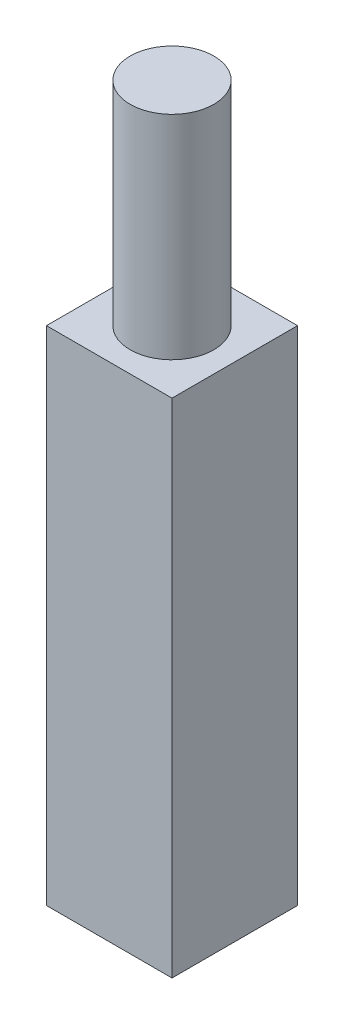
ISO-10303-21;
HEADER;
FILE_DESCRIPTION(('STEP AP214'),'2;1');
FILE_NAME('part.step','',(''),(''),'','','');
FILE_SCHEMA(('AUTOMOTIVE_DESIGN { 1 0 10303 214 1 1 1 1 }'));
ENDSEC;
DATA;
#1=APPLICATION_CONTEXT('core data for automotive mechanical design processes');
#2=APPLICATION_PROTOCOL_DEFINITION('international standard','automotive_design',2000,#1);
#3=PRODUCT_CONTEXT('',#1,'mechanical');
#4=PRODUCT('Part','Part','',(#3));
#5=PRODUCT_RELATED_PRODUCT_CATEGORY('part','',(#4));
#6=PRODUCT_DEFINITION_FORMATION('','',#4);
#7=PRODUCT_DEFINITION_CONTEXT('part definition',#1,'design');
#8=PRODUCT_DEFINITION('design','',#6,#7);
#9=PRODUCT_DEFINITION_SHAPE('','',#8);
#10=(LENGTH_UNIT() NAMED_UNIT(*) SI_UNIT(.MILLI.,.METRE.));
#11=(NAMED_UNIT(*) PLANE_ANGLE_UNIT() SI_UNIT($,.RADIAN.));
#12=(NAMED_UNIT(*) SI_UNIT($,.STERADIAN.) SOLID_ANGLE_UNIT());
#13=UNCERTAINTY_MEASURE_WITH_UNIT(LENGTH_MEASURE(1.E-05),#10,'distance_accuracy_value','');
#14=(GEOMETRIC_REPRESENTATION_CONTEXT(3) GLOBAL_UNCERTAINTY_ASSIGNED_CONTEXT((#13)) GLOBAL_UNIT_ASSIGNED_CONTEXT((#10,
#11,#12)) REPRESENTATION_CONTEXT('',''));
#15=CARTESIAN_POINT('',(0.,0.,0.));
#16=DIRECTION('',(0.,0.,1.));
#17=DIRECTION('',(1.,0.,0.));
#18=AXIS2_PLACEMENT_3D('',#15,#16,#17);
#19=CARTESIAN_POINT('',(7.49999999999998,60.,-7.50000000000009));
#20=DIRECTION('',(-1.,0.,0.));
#21=DIRECTION('',(0.,0.,1.));
#22=AXIS2_PLACEMENT_3D('',#19,#20,#21);
#23=PLANE('',#22);
#24=DIRECTION('',(0.,0.,-1.));
#25=VECTOR('',#24,1.);
#26=CARTESIAN_POINT('',(7.49999999999998,0.,-7.50000000000009));
#27=LINE('',#26,#25);
#28=CARTESIAN_POINT('',(7.49999999999998,0.,7.49999999999992));
#29=VERTEX_POINT('',#28);
#30=CARTESIAN_POINT('',(7.49999999999998,0.,-7.50000000000009));
#31=VERTEX_POINT('',#30);
#32=EDGE_CURVE('E110',#29,#31,#27,.T.);
#33=ORIENTED_EDGE('',*,*,#32,.T.);
#34=DIRECTION('',(0.,-1.,0.));
#35=VECTOR('',#34,1.);
#36=CARTESIAN_POINT('',(7.49999999999998,60.,-7.50000000000009));
#37=LINE('',#36,#35);
#38=CARTESIAN_POINT('',(7.49999999999998,60.,-7.50000000000009));
#39=VERTEX_POINT('',#38);
#40=EDGE_CURVE('E42',#39,#31,#37,.T.);
#41=ORIENTED_EDGE('',*,*,#40,.F.);
#42=DIRECTION('',(0.,0.,-1.));
#43=VECTOR('',#42,1.);
#44=CARTESIAN_POINT('',(7.49999999999998,60.,-7.50000000000009));
#45=LINE('',#44,#43);
#46=CARTESIAN_POINT('',(7.49999999999998,60.,7.49999999999992));
#47=VERTEX_POINT('',#46);
#48=EDGE_CURVE('E93',#47,#39,#45,.T.);
#49=ORIENTED_EDGE('',*,*,#48,.F.);
#50=DIRECTION('',(0.,-1.,0.));
#51=VECTOR('',#50,1.);
#52=CARTESIAN_POINT('',(7.49999999999998,60.,7.49999999999992));
#53=LINE('',#52,#51);
#54=EDGE_CURVE('E106',#47,#29,#53,.T.);
#55=ORIENTED_EDGE('',*,*,#54,.T.);
#56=EDGE_LOOP('',(#33,#41,#49,#55));
#57=FACE_BOUND('',#56,.T.);
#58=ADVANCED_FACE('F39',(#57),#23,.F.);
#59=CARTESIAN_POINT('',(-7.50000000000003,60.,-7.50000000000009));
#60=DIRECTION('',(0.,0.,1.));
#61=DIRECTION('',(1.,0.,0.));
#62=AXIS2_PLACEMENT_3D('',#59,#60,#61);
#63=PLANE('',#62);
#64=DIRECTION('',(-1.,0.,0.));
#65=VECTOR('',#64,1.);
#66=CARTESIAN_POINT('',(-7.50000000000003,0.,-7.50000000000009));
#67=LINE('',#66,#65);
#68=CARTESIAN_POINT('',(-7.50000000000003,0.,-7.50000000000009));
#69=VERTEX_POINT('',#68);
#70=EDGE_CURVE('E99',#31,#69,#67,.T.);
#71=ORIENTED_EDGE('',*,*,#70,.T.);
#72=DIRECTION('',(0.,-1.,0.));
#73=VECTOR('',#72,1.);
#74=CARTESIAN_POINT('',(-7.50000000000003,60.,-7.50000000000009));
#75=LINE('',#74,#73);
#76=CARTESIAN_POINT('',(-7.50000000000003,60.,-7.50000000000009));
#77=VERTEX_POINT('',#76);
#78=EDGE_CURVE('E97',#77,#69,#75,.T.);
#79=ORIENTED_EDGE('',*,*,#78,.F.);
#80=DIRECTION('',(-1.,0.,0.));
#81=VECTOR('',#80,1.);
#82=CARTESIAN_POINT('',(-7.50000000000003,60.,-7.50000000000009));
#83=LINE('',#82,#81);
#84=EDGE_CURVE('E88',#39,#77,#83,.T.);
#85=ORIENTED_EDGE('',*,*,#84,.F.);
#86=ORIENTED_EDGE('',*,*,#40,.T.);
#87=EDGE_LOOP('',(#71,#79,#85,#86));
#88=FACE_BOUND('',#87,.T.);
#89=ADVANCED_FACE('F98',(#88),#63,.F.);
#90=CARTESIAN_POINT('',(-7.50000000000003,60.,-7.50000000000009));
#91=DIRECTION('',(1.,0.,0.));
#92=DIRECTION('',(0.,0.,-1.));
#93=AXIS2_PLACEMENT_3D('',#90,#91,#92);
#94=PLANE('',#93);
#95=DIRECTION('',(0.,0.,1.));
#96=VECTOR('',#95,1.);
#97=CARTESIAN_POINT('',(-7.50000000000003,0.,-7.50000000000009));
#98=LINE('',#97,#96);
#99=CARTESIAN_POINT('',(-7.50000000000003,0.,7.49999999999992));
#100=VERTEX_POINT('',#99);
#101=EDGE_CURVE('E74',#69,#100,#98,.T.);
#102=ORIENTED_EDGE('',*,*,#101,.T.);
#103=DIRECTION('',(0.,-1.,0.));
#104=VECTOR('',#103,1.);
#105=CARTESIAN_POINT('',(-7.50000000000003,60.,7.49999999999992));
#106=LINE('',#105,#104);
#107=CARTESIAN_POINT('',(-7.50000000000003,60.,7.49999999999992));
#108=VERTEX_POINT('',#107);
#109=EDGE_CURVE('E101',#108,#100,#106,.T.);
#110=ORIENTED_EDGE('',*,*,#109,.F.);
#111=DIRECTION('',(0.,0.,1.));
#112=VECTOR('',#111,1.);
#113=CARTESIAN_POINT('',(-7.50000000000003,60.,-7.50000000000009));
#114=LINE('',#113,#112);
#115=EDGE_CURVE('E91',#77,#108,#114,.T.);
#116=ORIENTED_EDGE('',*,*,#115,.F.);
#117=ORIENTED_EDGE('',*,*,#78,.T.);
#118=EDGE_LOOP('',(#102,#110,#116,#117));
#119=FACE_BOUND('',#118,.T.);
#120=ADVANCED_FACE('F102',(#119),#94,.F.);
#121=CARTESIAN_POINT('',(-7.50000000000003,60.,7.49999999999992));
#122=DIRECTION('',(0.,0.,-1.));
#123=DIRECTION('',(-1.,0.,0.));
#124=AXIS2_PLACEMENT_3D('',#121,#122,#123);
#125=PLANE('',#124);
#126=DIRECTION('',(1.,0.,0.));
#127=VECTOR('',#126,1.);
#128=CARTESIAN_POINT('',(-7.50000000000003,0.,7.49999999999992));
#129=LINE('',#128,#127);
#130=EDGE_CURVE('E80',#100,#29,#129,.T.);
#131=ORIENTED_EDGE('',*,*,#130,.T.);
#132=ORIENTED_EDGE('',*,*,#54,.F.);
#133=DIRECTION('',(1.,0.,0.));
#134=VECTOR('',#133,1.);
#135=CARTESIAN_POINT('',(-7.50000000000003,60.,7.49999999999992));
#136=LINE('',#135,#134);
#137=EDGE_CURVE('E57',#108,#47,#136,.T.);
#138=ORIENTED_EDGE('',*,*,#137,.F.);
#139=ORIENTED_EDGE('',*,*,#109,.T.);
#140=EDGE_LOOP('',(#131,#132,#138,#139));
#141=FACE_BOUND('',#140,.T.);
#142=ADVANCED_FACE('F124',(#141),#125,.F.);
#143=CARTESIAN_POINT('',(0.,60.,0.));
#144=DIRECTION('',(0.,1.,0.));
#145=DIRECTION('',(0.,0.,1.));
#146=AXIS2_PLACEMENT_3D('',#143,#144,#145);
#147=PLANE('',#146);
#148=CARTESIAN_POINT('',(0.,60.,0.));
#149=DIRECTION('',(0.,1.,0.));
#150=DIRECTION('',(0.,0.,1.));
#151=AXIS2_PLACEMENT_3D('',#148,#149,#150);
#152=CIRCLE('',#151,5.);
#153=CARTESIAN_POINT('',(0.,60.,5.));
#154=VERTEX_POINT('',#153);
#155=EDGE_CURVE('E11',#154,#154,#152,.T.);
#156=ORIENTED_EDGE('',*,*,#155,.F.);
#157=EDGE_LOOP('',(#156));
#158=FACE_BOUND('',#157,.T.);
#159=ORIENTED_EDGE('',*,*,#48,.T.);
#160=ORIENTED_EDGE('',*,*,#84,.T.);
#161=ORIENTED_EDGE('',*,*,#115,.T.);
#162=ORIENTED_EDGE('',*,*,#137,.T.);
#163=EDGE_LOOP('',(#159,#160,#161,#162));
#164=FACE_BOUND('',#163,.T.);
#165=ADVANCED_FACE('F89',(#158,#164),#147,.T.);
#166=CARTESIAN_POINT('',(0.,0.,0.));
#167=DIRECTION('',(0.,1.,0.));
#168=DIRECTION('',(0.,0.,1.));
#169=AXIS2_PLACEMENT_3D('',#166,#167,#168);
#170=PLANE('',#169);
#171=ORIENTED_EDGE('',*,*,#32,.F.);
#172=ORIENTED_EDGE('',*,*,#130,.F.);
#173=ORIENTED_EDGE('',*,*,#101,.F.);
#174=ORIENTED_EDGE('',*,*,#70,.F.);
#175=EDGE_LOOP('',(#171,#172,#173,#174));
#176=FACE_BOUND('',#175,.T.);
#177=ADVANCED_FACE('F127',(#176),#170,.F.);
#178=CARTESIAN_POINT('',(0.,85.4,0.));
#179=DIRECTION('',(0.,-1.,0.));
#180=DIRECTION('',(0.,0.,-1.));
#181=AXIS2_PLACEMENT_3D('',#178,#179,#180);
#182=CYLINDRICAL_SURFACE('',#181,5.);
#183=CARTESIAN_POINT('',(0.,85.4,0.));
#184=DIRECTION('',(0.,1.,0.));
#185=DIRECTION('',(0.,0.,1.));
#186=AXIS2_PLACEMENT_3D('',#183,#184,#185);
#187=CIRCLE('',#186,5.);
#188=CARTESIAN_POINT('',(0.,85.4,5.));
#189=VERTEX_POINT('',#188);
#190=EDGE_CURVE('E114',#189,#189,#187,.T.);
#191=ORIENTED_EDGE('',*,*,#190,.F.);
#192=EDGE_LOOP('',(#191));
#193=FACE_BOUND('',#192,.T.);
#194=ORIENTED_EDGE('',*,*,#155,.T.);
#195=EDGE_LOOP('',(#194));
#196=FACE_BOUND('',#195,.T.);
#197=ADVANCED_FACE('F137',(#193,#196),#182,.T.);
#198=CARTESIAN_POINT('',(0.,85.4,0.));
#199=DIRECTION('',(0.,1.,0.));
#200=DIRECTION('',(0.,0.,1.));
#201=AXIS2_PLACEMENT_3D('',#198,#199,#200);
#202=PLANE('',#201);
#203=ORIENTED_EDGE('',*,*,#190,.T.);
#204=EDGE_LOOP('',(#203));
#205=FACE_BOUND('',#204,.T.);
#206=ADVANCED_FACE('F135',(#205),#202,.T.);
#207=CLOSED_SHELL('',(#58,#89,#120,#142,#165,#177,#197,#206));
#208=MANIFOLD_SOLID_BREP('B2',#207);
#209=ADVANCED_BREP_SHAPE_REPRESENTATION('',(#18,#208),#14);
#210=SHAPE_DEFINITION_REPRESENTATION(#9,#209);
ENDSEC;
END-ISO-10303-21;
